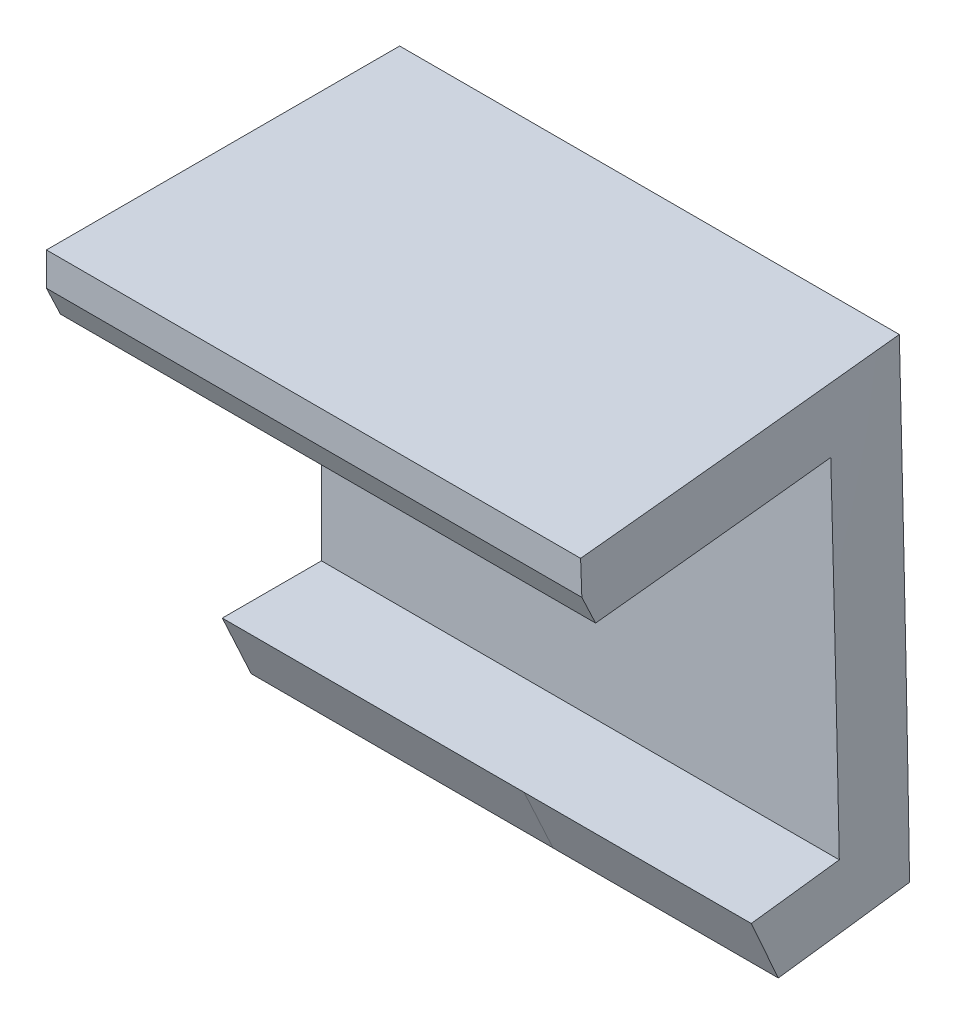
ISO-10303-21;
HEADER;
FILE_DESCRIPTION(('STEP AP214'),'2;1');
FILE_NAME('part.step','',(''),(''),'','','');
FILE_SCHEMA(('AUTOMOTIVE_DESIGN { 1 0 10303 214 1 1 1 1 }'));
ENDSEC;
DATA;
#1=APPLICATION_CONTEXT('core data for automotive mechanical design processes');
#2=APPLICATION_PROTOCOL_DEFINITION('international standard','automotive_design',2000,#1);
#3=PRODUCT_CONTEXT('',#1,'mechanical');
#4=PRODUCT('Part','Part','',(#3));
#5=PRODUCT_RELATED_PRODUCT_CATEGORY('part','',(#4));
#6=PRODUCT_DEFINITION_FORMATION('','',#4);
#7=PRODUCT_DEFINITION_CONTEXT('part definition',#1,'design');
#8=PRODUCT_DEFINITION('design','',#6,#7);
#9=PRODUCT_DEFINITION_SHAPE('','',#8);
#10=(LENGTH_UNIT() NAMED_UNIT(*) SI_UNIT(.MILLI.,.METRE.));
#11=(NAMED_UNIT(*) PLANE_ANGLE_UNIT() SI_UNIT($,.RADIAN.));
#12=(NAMED_UNIT(*) SI_UNIT($,.STERADIAN.) SOLID_ANGLE_UNIT());
#13=UNCERTAINTY_MEASURE_WITH_UNIT(LENGTH_MEASURE(1.E-05),#10,'distance_accuracy_value','');
#14=(GEOMETRIC_REPRESENTATION_CONTEXT(3) GLOBAL_UNCERTAINTY_ASSIGNED_CONTEXT((#13)) GLOBAL_UNIT_ASSIGNED_CONTEXT((#10,
#11,#12)) REPRESENTATION_CONTEXT('',''));
#15=CARTESIAN_POINT('',(0.,0.,0.));
#16=DIRECTION('',(0.,0.,1.));
#17=DIRECTION('',(1.,0.,0.));
#18=AXIS2_PLACEMENT_3D('',#15,#16,#17);
#19=CARTESIAN_POINT('',(138.441970265516,58.9864015562166,21.4522105914858));
#20=DIRECTION('',(-1.,0.,0.));
#21=DIRECTION('',(0.,0.,1.));
#22=AXIS2_PLACEMENT_3D('',#19,#20,#21);
#23=PLANE('',#22);
#24=CARTESIAN_POINT('',(138.441970265516,42.8621191093471,21.2239942519831));
#25=CARTESIAN_POINT('',(138.441970265516,42.7369326642426,21.1644427052116));
#26=CARTESIAN_POINT('',(138.441970265516,42.6116961267293,21.1048814049397));
#27=CARTESIAN_POINT('',(138.441970265516,42.4864015562166,21.0453157806406));
#28=(BOUNDED_CURVE() B_SPLINE_CURVE(3,(#24,#25,#26,#27),.UNSPECIFIED.,.F.,
.F.) B_SPLINE_CURVE_WITH_KNOTS((4,4),(-0.748256264685085,-0.701957454945299),
.UNSPECIFIED.) CURVE() GEOMETRIC_REPRESENTATION_ITEM() RATIONAL_B_SPLINE_CURVE((1.,1.,1.,1.)) REPRESENTATION_ITEM(''));
#29=CARTESIAN_POINT('',(138.441970265516,42.4864015562166,21.0453157806406));
#30=VERTEX_POINT('',#29);
#31=CARTESIAN_POINT('',(138.441970265516,42.8621191093471,21.2239942519831));
#32=VERTEX_POINT('',#31);
#33=EDGE_CURVE('E126',#30,#32,#28,.F.);
#34=ORIENTED_EDGE('',*,*,#33,.T.);
#35=DIRECTION('',(0.,-1.,0.));
#36=VECTOR('',#35,1.);
#37=CARTESIAN_POINT('',(138.441970265516,43.2864015562166,21.2239942519831));
#38=LINE('',#37,#36);
#39=CARTESIAN_POINT('',(138.441970265516,43.2864015562166,21.2239942519831));
#40=VERTEX_POINT('',#39);
#41=EDGE_CURVE('E47',#40,#32,#38,.T.);
#42=ORIENTED_EDGE('',*,*,#41,.F.);
#43=DIRECTION('',(0.,0.,1.));
#44=VECTOR('',#43,1.);
#45=CARTESIAN_POINT('',(138.441970265516,43.2864015562166,16.7084422828931));
#46=LINE('',#45,#44);
#47=CARTESIAN_POINT('',(138.441970265516,43.2864015562166,16.7084422828931));
#48=VERTEX_POINT('',#47);
#49=EDGE_CURVE('E142',#48,#40,#46,.T.);
#50=ORIENTED_EDGE('',*,*,#49,.F.);
#51=DIRECTION('',(0.,1.,0.));
#52=VECTOR('',#51,1.);
#53=CARTESIAN_POINT('',(138.441970265516,37.2864015562167,16.7084422828931));
#54=LINE('',#53,#52);
#55=CARTESIAN_POINT('',(138.441970265516,37.2864015562167,16.7084422828931));
#56=VERTEX_POINT('',#55);
#57=EDGE_CURVE('E147',#56,#48,#54,.T.);
#58=ORIENTED_EDGE('',*,*,#57,.F.);
#59=DIRECTION('',(0.,0.,-1.));
#60=VECTOR('',#59,1.);
#61=CARTESIAN_POINT('',(138.441970265516,37.2864015562166,21.2239942519831));
#62=LINE('',#61,#60);
#63=CARTESIAN_POINT('',(138.441970265516,37.2864015562166,18.6068869298385));
#64=VERTEX_POINT('',#63);
#65=EDGE_CURVE('E148',#64,#56,#62,.T.);
#66=ORIENTED_EDGE('',*,*,#65,.F.);
#67=CARTESIAN_POINT('',(138.441970265515,-89.9771736995002,295.611131350484));
#68=DIRECTION('',(-1.,0.,0.));
#69=DIRECTION('',(0.,-1.,0.));
#70=AXIS2_PLACEMENT_3D('',#67,#68,#69);
#71=CIRCLE('',#70,304.839907187232);
#72=CARTESIAN_POINT('',(138.441970265516,38.0864015562166,18.9758304457663));
#73=VERTEX_POINT('',#72);
#74=EDGE_CURVE('E428',#64,#73,#71,.F.);
#75=ORIENTED_EDGE('',*,*,#74,.T.);
#76=DIRECTION('',(0.,0.,1.));
#77=VECTOR('',#76,1.);
#78=CARTESIAN_POINT('',(138.441970265516,38.0864015562166,17.7084422828931));
#79=LINE('',#78,#77);
#80=CARTESIAN_POINT('',(138.441970265516,38.0864015562166,17.7084422828931));
#81=VERTEX_POINT('',#80);
#82=EDGE_CURVE('E145',#81,#73,#79,.T.);
#83=ORIENTED_EDGE('',*,*,#82,.F.);
#84=DIRECTION('',(0.,-1.,0.));
#85=VECTOR('',#84,1.);
#86=CARTESIAN_POINT('',(138.441970265516,42.4864015562166,17.7084422828931));
#87=LINE('',#86,#85);
#88=CARTESIAN_POINT('',(138.441970265516,42.4864015562166,17.7084422828931));
#89=VERTEX_POINT('',#88);
#90=EDGE_CURVE('E151',#89,#81,#87,.T.);
#91=ORIENTED_EDGE('',*,*,#90,.F.);
#92=DIRECTION('',(0.,0.,-1.));
#93=VECTOR('',#92,1.);
#94=CARTESIAN_POINT('',(138.441970265516,42.4864015562166,21.2239942519831));
#95=LINE('',#94,#93);
#96=EDGE_CURVE('E11',#30,#89,#95,.T.);
#97=ORIENTED_EDGE('',*,*,#96,.F.);
#98=EDGE_LOOP('',(#34,#42,#50,#58,#66,#75,#83,#91,#97));
#99=FACE_BOUND('',#98,.T.);
#100=ADVANCED_FACE('F38',(#99),#23,.T.);
#101=CARTESIAN_POINT('',(138.441970265516,42.4864015562166,19.4662182674381));
#102=DIRECTION('',(0.,-1.,0.));
#103=DIRECTION('',(-1.,0.,0.));
#104=AXIS2_PLACEMENT_3D('',#101,#102,#103);
#105=PLANE('',#104);
#106=DIRECTION('',(-1.,0.,0.));
#107=VECTOR('',#106,1.);
#108=CARTESIAN_POINT('',(146.228701255175,42.4864015562166,21.0453157806406));
#109=LINE('',#108,#107);
#110=CARTESIAN_POINT('',(145.283639860046,42.4864015562166,21.0453157806406));
#111=VERTEX_POINT('',#110);
#112=EDGE_CURVE('E133',#111,#30,#109,.T.);
#113=ORIENTED_EDGE('',*,*,#112,.T.);
#114=ORIENTED_EDGE('',*,*,#96,.T.);
#115=DIRECTION('',(1.,0.,0.));
#116=VECTOR('',#115,1.);
#117=CARTESIAN_POINT('',(138.441970265516,42.4864015562166,17.7084422828931));
#118=LINE('',#117,#116);
#119=CARTESIAN_POINT('',(144.953114036715,42.4864015562165,17.7084422828931));
#120=VERTEX_POINT('',#119);
#121=EDGE_CURVE('E42',#89,#120,#118,.T.);
#122=ORIENTED_EDGE('',*,*,#121,.T.);
#123=CARTESIAN_POINT('',(144.953114036715,42.4864015562165,17.7084422828931));
#124=CARTESIAN_POINT('',(144.981425489518,42.4864015562165,17.9864383334114));
#125=CARTESIAN_POINT('',(145.009513746378,42.4864015562166,18.2644569569387));
#126=CARTESIAN_POINT('',(145.065321171474,42.4864015562166,18.8205313966835));
#127=CARTESIAN_POINT('',(145.093040339535,42.4864015562166,19.0985872129187));
#128=CARTESIAN_POINT('',(145.148186835367,42.4864015562166,19.654727536487));
#129=CARTESIAN_POINT('',(145.175614163436,42.4864015562166,19.9328120437907));
#130=CARTESIAN_POINT('',(145.230011609723,42.4864015562166,20.4890262319451));
#131=CARTESIAN_POINT('',(145.25698172712,42.4864015562166,20.7671559128761));
#132=CARTESIAN_POINT('',(145.283640490335,42.4864015562166,21.0453157806406));
#133=B_SPLINE_CURVE_WITH_KNOTS('',3,(#123,#124,#125,#126,#127,#128,#129,#130,#131,#132),
.UNSPECIFIED.,.F.,.F.,(4,2,2,2,4),(0.,0.838301566937911,1.6766035333056,2.51490464550656,
3.35320726381075),.UNSPECIFIED.);
#134=EDGE_CURVE('E220',#120,#111,#133,.T.);
#135=ORIENTED_EDGE('',*,*,#134,.T.);
#136=EDGE_LOOP('',(#113,#114,#122,#135));
#137=FACE_BOUND('',#136,.T.);
#138=ADVANCED_FACE('F291',(#137),#105,.T.);
#139=CARTESIAN_POINT('',(138.441970265516,42.8864015562166,21.2239942519831));
#140=DIRECTION('',(0.,0.,1.));
#141=DIRECTION('',(0.,-1.,0.));
#142=AXIS2_PLACEMENT_3D('',#139,#140,#141);
#143=PLANE('',#142);
#144=ORIENTED_EDGE('',*,*,#41,.T.);
#145=DIRECTION('',(-1.,0.,0.));
#146=VECTOR('',#145,1.);
#147=CARTESIAN_POINT('',(146.228701255175,42.862119109347,21.2239942519831));
#148=LINE('',#147,#146);
#149=CARTESIAN_POINT('',(145.286768908345,42.862119109347,21.2239942519831));
#150=VERTEX_POINT('',#149);
#151=EDGE_CURVE('E123',#150,#32,#148,.T.);
#152=ORIENTED_EDGE('',*,*,#151,.F.);
#153=CARTESIAN_POINT('',(145.286768908345,42.862119109347,21.2239942519831));
#154=CARTESIAN_POINT('',(145.284122398998,42.93283352983,21.2239942519831));
#155=CARTESIAN_POINT('',(145.281466875231,43.0035476106439,21.2239942519831));
#156=CARTESIAN_POINT('',(145.276137798858,43.1449750929337,21.2239942519831));
#157=CARTESIAN_POINT('',(145.273464246252,43.2156884944096,21.2239942519831));
#158=CARTESIAN_POINT('',(145.270781679226,43.2864015562165,21.2239942519831));
#159=B_SPLINE_CURVE_WITH_KNOTS('',3,(#153,#154,#155,#156,#157,#158),.UNSPECIFIED.,.F.,.F.,(4,2,
4),(0.,0.212291773949166,0.424583547898327),.UNSPECIFIED.);
#160=CARTESIAN_POINT('',(145.270781679226,43.2864015562165,21.2239942519831));
#161=VERTEX_POINT('',#160);
#162=EDGE_CURVE('E211',#150,#161,#159,.T.);
#163=ORIENTED_EDGE('',*,*,#162,.T.);
#164=DIRECTION('',(1.,0.,0.));
#165=VECTOR('',#164,1.);
#166=CARTESIAN_POINT('',(138.441970265516,43.2864015562166,21.2239942519831));
#167=LINE('',#166,#165);
#168=EDGE_CURVE('E139',#40,#161,#167,.T.);
#169=ORIENTED_EDGE('',*,*,#168,.F.);
#170=EDGE_LOOP('',(#144,#152,#163,#169));
#171=FACE_BOUND('',#170,.T.);
#172=ADVANCED_FACE('F138',(#171),#143,.T.);
#173=CARTESIAN_POINT('',(138.441970265516,43.2864015562166,18.9662182674381));
#174=DIRECTION('',(0.,1.,0.));
#175=DIRECTION('',(1.,0.,0.));
#176=AXIS2_PLACEMENT_3D('',#173,#174,#175);
#177=PLANE('',#176);
#178=ORIENTED_EDGE('',*,*,#168,.T.);
#179=CARTESIAN_POINT('',(145.270781679226,43.2864015562165,21.2239942519832));
#180=CARTESIAN_POINT('',(145.253123138486,43.2864015562165,21.035778455035));
#181=CARTESIAN_POINT('',(145.235343250566,43.2864015562165,20.8475740947518));
#182=CARTESIAN_POINT('',(145.199582139298,43.2864015562165,20.4711845794441));
#183=CARTESIAN_POINT('',(145.181600916038,43.2864015562165,20.2829994244112));
#184=CARTESIAN_POINT('',(145.145478536035,43.2864015562165,19.9066450967054));
#185=CARTESIAN_POINT('',(145.127337379811,43.2864015562165,19.7184759239827));
#186=CARTESIAN_POINT('',(145.090948733074,43.2864015562166,19.3421478367115));
#187=CARTESIAN_POINT('',(145.072701242535,43.2864015562166,19.1539889221657));
#188=CARTESIAN_POINT('',(145.017759116928,43.2864015562166,18.589526198822));
#189=CARTESIAN_POINT('',(144.980865328875,43.2864015562166,18.2132416339496));
#190=CARTESIAN_POINT('',(144.906152113157,43.2864015562166,17.4607633402078));
#191=CARTESIAN_POINT('',(144.868332682487,43.2864015562165,17.0845696116373));
#192=CARTESIAN_POINT('',(144.829853263433,43.2864015562166,16.7084422828931));
#193=B_SPLINE_CURVE_WITH_KNOTS('',3,(#179,#180,#181,#182,#183,#184,#185,#186,#187,#188,#189,
#190,#191,#192),.UNSPECIFIED.,.F.,.F.,(4,2,2,2,2,2,4),(0.,0.567126937655628,1.13425362553777,
1.7013784721359,2.26850346325662,3.4027691883038,4.53703859634097),.UNSPECIFIED.);
#194=CARTESIAN_POINT('',(144.829853263433,43.2864015562166,16.7084422828931));
#195=VERTEX_POINT('',#194);
#196=EDGE_CURVE('E268',#161,#195,#193,.T.);
#197=ORIENTED_EDGE('',*,*,#196,.T.);
#198=DIRECTION('',(1.,0.,0.));
#199=VECTOR('',#198,1.);
#200=CARTESIAN_POINT('',(138.441970265516,43.2864015562166,16.7084422828931));
#201=LINE('',#200,#199);
#202=EDGE_CURVE('E155',#48,#195,#201,.T.);
#203=ORIENTED_EDGE('',*,*,#202,.F.);
#204=ORIENTED_EDGE('',*,*,#49,.T.);
#205=EDGE_LOOP('',(#178,#197,#203,#204));
#206=FACE_BOUND('',#205,.T.);
#207=ADVANCED_FACE('F40',(#206),#177,.T.);
#208=CARTESIAN_POINT('',(138.441970265516,40.2864015562166,16.7084422828931));
#209=DIRECTION('',(0.,0.,-1.));
#210=DIRECTION('',(0.,-1.,0.));
#211=AXIS2_PLACEMENT_3D('',#208,#209,#210);
#212=PLANE('',#211);
#213=ORIENTED_EDGE('',*,*,#202,.T.);
#214=CARTESIAN_POINT('',(144.829853263433,43.2864015562166,16.7084422828931));
#215=CARTESIAN_POINT('',(144.838246232589,42.9530925434356,16.7084422828931));
#216=CARTESIAN_POINT('',(144.846580383757,42.6197819501718,16.7084422828931));
#217=CARTESIAN_POINT('',(144.862999469421,41.9531558893104,16.7084422828931));
#218=CARTESIAN_POINT('',(144.87108440485,41.6198404217356,16.7084422828931));
#219=CARTESIAN_POINT('',(144.886873520473,40.9532013607333,16.7084422828931));
#220=CARTESIAN_POINT('',(144.894577701758,40.6198777673319,16.7084422828931));
#221=CARTESIAN_POINT('',(144.909485937683,39.9532188628369,16.7084422828931));
#222=CARTESIAN_POINT('',(144.91668999159,39.6198835517268,16.7084422828931));
#223=CARTESIAN_POINT('',(144.930478703947,38.9531995371911,16.7084422828931));
#224=CARTESIAN_POINT('',(144.93706336153,38.6198508337474,16.7084422828931));
#225=CARTESIAN_POINT('',(144.949487754285,37.9531377299988,16.7084422828931));
#226=CARTESIAN_POINT('',(144.955327485298,37.6197733296168,16.7084422828931));
#227=CARTESIAN_POINT('',(144.960731957429,37.2864015562165,16.7084422828931));
#228=B_SPLINE_CURVE_WITH_KNOTS('',3,(#214,#215,#216,#217,#218,#219,#220,#221,#222,#223,#224,
#225,#226,#227),.UNSPECIFIED.,.F.,.F.,(4,2,2,2,2,2,4),(0.,1.00024415123927,2.00048456110018,
3.00072210435743,4.00096111296956,5.0012015221897,6.00144751578877),.UNSPECIFIED.);
#229=CARTESIAN_POINT('',(144.960731957429,37.2864015562166,16.7084422828931));
#230=VERTEX_POINT('',#229);
#231=EDGE_CURVE('E262',#195,#230,#228,.T.);
#232=ORIENTED_EDGE('',*,*,#231,.T.);
#233=DIRECTION('',(1.,0.,0.));
#234=VECTOR('',#233,1.);
#235=CARTESIAN_POINT('',(138.441970265516,37.2864015562167,16.7084422828931));
#236=LINE('',#235,#234);
#237=EDGE_CURVE('E85',#56,#230,#236,.T.);
#238=ORIENTED_EDGE('',*,*,#237,.F.);
#239=ORIENTED_EDGE('',*,*,#57,.T.);
#240=EDGE_LOOP('',(#213,#232,#238,#239));
#241=FACE_BOUND('',#240,.T.);
#242=ADVANCED_FACE('F313',(#241),#212,.T.);
#243=CARTESIAN_POINT('',(138.441970265516,37.2864015562166,18.9662182674381));
#244=DIRECTION('',(0.,-1.,0.));
#245=DIRECTION('',(-1.,0.,0.));
#246=AXIS2_PLACEMENT_3D('',#243,#244,#245);
#247=PLANE('',#246);
#248=DIRECTION('',(1.,0.,0.));
#249=VECTOR('',#248,1.);
#250=CARTESIAN_POINT('',(138.440970265516,37.2864015562166,18.6068869298385));
#251=LINE('',#250,#249);
#252=CARTESIAN_POINT('',(142.301123440301,37.2864015562166,18.6068869298385));
#253=VERTEX_POINT('',#252);
#254=EDGE_CURVE('E55',#64,#253,#251,.T.);
#255=ORIENTED_EDGE('',*,*,#254,.F.);
#256=ORIENTED_EDGE('',*,*,#65,.T.);
#257=ORIENTED_EDGE('',*,*,#237,.T.);
#258=CARTESIAN_POINT('',(144.960731957429,37.2864015562166,16.7084422828931));
#259=CARTESIAN_POINT('',(144.979544855276,37.2864015562166,16.8665918107964));
#260=CARTESIAN_POINT('',(144.998251554025,37.2864015562166,17.0247539942806));
#261=CARTESIAN_POINT('',(145.035437426485,37.2864015562166,17.341104725738));
#262=CARTESIAN_POINT('',(145.053916600729,37.2864015562165,17.4992932736485));
#263=CARTESIAN_POINT('',(145.090632387156,37.2864015562165,17.8156985414489));
#264=CARTESIAN_POINT('',(145.108868999321,37.2864015562165,17.9739152613408));
#265=CARTESIAN_POINT('',(145.145084990407,37.2864015562165,18.2903785112778));
#266=CARTESIAN_POINT('',(145.163064368723,37.2864015562165,18.4486250413919));
#267=CARTESIAN_POINT('',(145.180907752322,37.2864015562165,18.6068869298385));
#268=B_SPLINE_CURVE_WITH_KNOTS('',3,(#258,#259,#260,#261,#262,#263,#264,#265,#266,#267),
.UNSPECIFIED.,.F.,.F.,(4,2,2,2,4),(0.,0.477793659850592,0.955586197649547,1.4333787698146,
1.9111724640312),.UNSPECIFIED.);
#269=CARTESIAN_POINT('',(145.180907142459,37.2864015562165,18.6068869298385));
#270=VERTEX_POINT('',#269);
#271=EDGE_CURVE('E134',#230,#270,#268,.T.);
#272=ORIENTED_EDGE('',*,*,#271,.T.);
#273=DIRECTION('',(-1.,0.,0.));
#274=VECTOR('',#273,1.);
#275=CARTESIAN_POINT('',(146.228701255175,37.2864015562165,18.6068869298385));
#276=LINE('',#275,#274);
#277=EDGE_CURVE('E169',#270,#253,#276,.T.);
#278=ORIENTED_EDGE('',*,*,#277,.T.);
#279=EDGE_LOOP('',(#255,#256,#257,#272,#278));
#280=FACE_BOUND('',#279,.T.);
#281=ADVANCED_FACE('F310',(#280),#247,.T.);
#282=CARTESIAN_POINT('',(138.441970265516,38.0864015562166,19.4662182674381));
#283=DIRECTION('',(0.,1.,0.));
#284=DIRECTION('',(1.,0.,0.));
#285=AXIS2_PLACEMENT_3D('',#282,#283,#284);
#286=PLANE('',#285);
#287=DIRECTION('',(1.,0.,0.));
#288=VECTOR('',#287,1.);
#289=CARTESIAN_POINT('',(138.440970265516,38.0864015562166,18.9758304457663));
#290=LINE('',#289,#288);
#291=CARTESIAN_POINT('',(142.301123440301,38.0864015562166,18.9758304457663));
#292=VERTEX_POINT('',#291);
#293=EDGE_CURVE('E302',#73,#292,#290,.T.);
#294=ORIENTED_EDGE('',*,*,#293,.T.);
#295=DIRECTION('',(-1.,0.,0.));
#296=VECTOR('',#295,1.);
#297=CARTESIAN_POINT('',(146.228701255175,38.0864015562166,18.9758304457663));
#298=LINE('',#297,#296);
#299=CARTESIAN_POINT('',(145.204524800934,38.0864015562166,18.9758304457663));
#300=VERTEX_POINT('',#299);
#301=EDGE_CURVE('E173',#300,#292,#298,.T.);
#302=ORIENTED_EDGE('',*,*,#301,.F.);
#303=CARTESIAN_POINT('',(145.204525709516,38.0864015562166,18.9758304457663));
#304=CARTESIAN_POINT('',(145.181253755187,38.0864015562166,18.764552523953));
#305=CARTESIAN_POINT('',(145.157774194478,38.0864015562166,18.5532978828069));
#306=CARTESIAN_POINT('',(145.110399860298,38.0864015562165,18.1308351618493));
#307=CARTESIAN_POINT('',(145.086505086828,38.0864015562165,17.9196270820378));
#308=CARTESIAN_POINT('',(145.062402706977,38.0864015562164,17.7084422828936));
#309=B_SPLINE_CURVE_WITH_KNOTS('',3,(#303,#304,#305,#306,#307,#308),.UNSPECIFIED.,.F.,.F.,(4,2,
4),(0.,0.637666306614755,1.2753326132295),.UNSPECIFIED.);
#310=CARTESIAN_POINT('',(145.062402706977,38.0864015562166,17.7084422828931));
#311=VERTEX_POINT('',#310);
#312=EDGE_CURVE('E226',#300,#311,#309,.T.);
#313=ORIENTED_EDGE('',*,*,#312,.T.);
#314=DIRECTION('',(1.,0.,0.));
#315=VECTOR('',#314,1.);
#316=CARTESIAN_POINT('',(138.441970265516,38.0864015562166,17.7084422828931));
#317=LINE('',#316,#315);
#318=EDGE_CURVE('E149',#81,#311,#317,.T.);
#319=ORIENTED_EDGE('',*,*,#318,.F.);
#320=ORIENTED_EDGE('',*,*,#82,.T.);
#321=EDGE_LOOP('',(#294,#302,#313,#319,#320));
#322=FACE_BOUND('',#321,.T.);
#323=ADVANCED_FACE('F300',(#322),#286,.T.);
#324=CARTESIAN_POINT('',(138.441970265516,40.2864015562166,17.7084422828931));
#325=DIRECTION('',(0.,0.,1.));
#326=DIRECTION('',(1.,0.,0.));
#327=AXIS2_PLACEMENT_3D('',#324,#325,#326);
#328=PLANE('',#327);
#329=ORIENTED_EDGE('',*,*,#318,.T.);
#330=CARTESIAN_POINT('',(145.062402706977,38.0864015562166,17.7084422828931));
#331=CARTESIAN_POINT('',(145.054778074579,38.4531036544115,17.7084422828931));
#332=CARTESIAN_POINT('',(145.046671842499,38.8197953334699,17.7084422828931));
#333=CARTESIAN_POINT('',(145.02966448807,39.5531592290661,17.7084422828931));
#334=CARTESIAN_POINT('',(145.020763368082,39.9198314456583,17.7084422828931));
#335=CARTESIAN_POINT('',(145.002334503159,40.6531598303879,17.7084422828931));
#336=CARTESIAN_POINT('',(144.992806758461,41.0198159985313,17.7084422828931));
#337=CARTESIAN_POINT('',(144.973277498469,41.7531168395399,17.7084422828931));
#338=CARTESIAN_POINT('',(144.963275981769,42.1197615123678,17.7084422828931));
#339=CARTESIAN_POINT('',(144.953114036715,42.4864015562165,17.7084422828931));
#340=B_SPLINE_CURVE_WITH_KNOTS('',3,(#330,#331,#332,#333,#334,#335,#336,#337,#338,#339),
.UNSPECIFIED.,.F.,.F.,(4,2,2,2,4),(0.,1.10034317917701,2.20068309181714,3.30102258768743,
4.40136535009585),.UNSPECIFIED.);
#341=EDGE_CURVE('E230',#311,#120,#340,.T.);
#342=ORIENTED_EDGE('',*,*,#341,.T.);
#343=ORIENTED_EDGE('',*,*,#121,.F.);
#344=ORIENTED_EDGE('',*,*,#90,.T.);
#345=EDGE_LOOP('',(#329,#342,#343,#344));
#346=FACE_BOUND('',#345,.T.);
#347=ADVANCED_FACE('F294',(#346),#328,.T.);
#348=CARTESIAN_POINT('',(145.292643366567,46.2352111335059,22.8249641058051));
#349=CARTESIAN_POINT('',(145.292715670716,46.2161716820332,22.8159848987683));
#350=CARTESIAN_POINT('',(145.294354665075,45.7742523069027,22.6075320882647));
#351=CARTESIAN_POINT('',(145.295789350292,44.9096792492725,22.1981147436125));
#352=CARTESIAN_POINT('',(145.29256128028,43.6409800443879,21.5947369973265));
#353=CARTESIAN_POINT('',(145.283595206326,42.3701437639069,20.9898036421991));
#354=CARTESIAN_POINT('',(145.268439343964,41.0948267012698,20.3845890044108));
#355=CARTESIAN_POINT('',(145.246585031453,39.8133930144486,19.7802964503774));
#356=CARTESIAN_POINT('',(145.21746823689,38.5247607600021,19.1780783715676));
#357=CARTESIAN_POINT('',(145.180467920989,37.2284787042143,18.5790531005983));
#358=CARTESIAN_POINT('',(145.134916326958,35.924556828039,17.9842103770565));
#359=CARTESIAN_POINT('',(145.080104694923,34.6137204159724,17.3937760116011));
#360=CARTESIAN_POINT('',(145.015166200294,33.2968274722133,16.8089089777821));
#361=CARTESIAN_POINT('',(144.939215051884,31.9752710103335,16.2305547959101));
#362=CARTESIAN_POINT('',(144.871430507781,30.9537505085406,15.7902512437439));
#363=CARTESIAN_POINT('',(144.82923399511,30.3734283781046,15.542636394938));
#364=CARTESIAN_POINT('',(144.818942295739,30.2348587544011,15.4836538067465));
#365=CARTESIAN_POINT('',(145.23118208207,46.1945141052125,22.0726826087883));
#366=CARTESIAN_POINT('',(145.23123945345,46.1754469086034,22.0640570758335));
#367=CARTESIAN_POINT('',(145.232533120329,45.7328768845372,21.863813072157));
#368=CARTESIAN_POINT('',(145.233348807338,44.866818183206,21.4704385861034));
#369=CARTESIAN_POINT('',(145.229360595116,43.5956416580975,20.8904773726773));
#370=CARTESIAN_POINT('',(145.219754274966,42.3223997351965,20.3087984010157));
#371=CARTESIAN_POINT('',(145.204050347856,41.0450159026494,19.7266292055811));
#372=CARTESIAN_POINT('',(145.181719602998,39.7620403041004,19.145128056017));
#373=CARTESIAN_POINT('',(145.152182056274,38.4726894922078,18.5654048250947));
#374=CARTESIAN_POINT('',(145.114799252497,37.1766419447374,17.9885365825417));
#375=CARTESIAN_POINT('',(145.068889265523,35.874001851605,17.4154802457113));
#376=CARTESIAN_POINT('',(145.013733454357,34.5656078632023,16.84645633009));
#377=CARTESIAN_POINT('',(144.948466486685,33.2523115755084,16.2825840051212));
#378=CARTESIAN_POINT('',(144.872166840972,31.935512013565,15.724784420237));
#379=CARTESIAN_POINT('',(144.804186376479,30.9185575530304,15.2998528210823));
#380=CARTESIAN_POINT('',(144.761767209635,30.3410690237516,15.0608081724359));
#381=CARTESIAN_POINT('',(144.751414342138,30.2031894948503,15.0038635464812));
#382=CARTESIAN_POINT('',(145.10808702886,46.0797064612533,20.5957090065986));
#383=CARTESIAN_POINT('',(145.108112907336,46.0605981039427,20.5877673423778));
#384=CARTESIAN_POINT('',(145.108677782088,45.617064544668,20.4033963227921));
#385=CARTESIAN_POINT('',(145.108164276966,44.7488997455524,20.0410573484355));
#386=CARTESIAN_POINT('',(145.102481066339,43.4745298099494,19.506432084151));
#387=CARTESIAN_POINT('',(145.091383585614,42.1985381582999,18.9698056286328));
#388=CARTESIAN_POINT('',(145.074340921474,40.919352991033,18.432313795848));
#389=CARTESIAN_POINT('',(145.050787858805,39.6357971720958,17.895031497442));
#390=CARTESIAN_POINT('',(145.02011771928,38.3476058635824,17.3589891989597));
#391=CARTESIAN_POINT('',(144.981662313651,37.0546405512182,16.825190387585));
#392=CARTESIAN_POINT('',(144.934716420947,35.7571271997388,16.2945085732848));
#393=CARTESIAN_POINT('',(144.878546788619,34.4560777056042,15.7671349277429));
#394=CARTESIAN_POINT('',(144.812296499439,33.1522797743469,15.2440749457713));
#395=CARTESIAN_POINT('',(144.734975853584,31.8471118875531,14.7262511433062));
#396=CARTESIAN_POINT('',(144.666363735124,30.840740006255,14.3313459279441));
#397=CARTESIAN_POINT('',(144.623360712846,30.2696869190903,14.1090680127522));
#398=CARTESIAN_POINT('',(144.612852253998,30.1333684734716,14.0561097289791));
#399=CARTESIAN_POINT('',(144.928748528409,45.8313056352206,18.4648897324114));
#400=CARTESIAN_POINT('',(144.928710770657,45.8121883906115,18.4579040614451));
#401=CARTESIAN_POINT('',(144.927801168407,45.3684480154743,18.2957230038003));
#402=CARTESIAN_POINT('',(144.92451689411,44.4999353071051,17.9768086087873));
#403=CARTESIAN_POINT('',(144.915080099105,43.2258754388495,17.5057237841142));
#404=CARTESIAN_POINT('',(144.900477388665,41.9513989381843,17.0323519855983));
#405=CARTESIAN_POINT('',(144.880112035707,40.6755612894933,16.5576915788912));
#406=CARTESIAN_POINT('',(144.853378163767,39.3974067156949,16.082676245688));
#407=CARTESIAN_POINT('',(144.819644070439,38.117277789963,15.6082040453565));
#408=CARTESIAN_POINT('',(144.778210606955,36.8351464588567,15.1351452063737));
#409=CARTESIAN_POINT('',(144.728350957703,35.5512776461586,14.6643219957981));
#410=CARTESIAN_POINT('',(144.669323994036,34.2668265690774,14.1959572981869));
#411=CARTESIAN_POINT('',(144.600299469929,32.9823814978558,13.7310051504255));
#412=CARTESIAN_POINT('',(144.520194434324,31.6992033257195,13.2703412055572));
#413=CARTESIAN_POINT('',(144.449724864174,30.7117721013247,12.9184192247878));
#414=CARTESIAN_POINT('',(144.405333389695,30.1519455938186,12.7201558785653));
#415=CARTESIAN_POINT('',(144.394469321032,30.0183323434163,12.6729091733836));
#416=CARTESIAN_POINT('',(144.76553257299,45.6205885798533,16.635240265859));
#417=CARTESIAN_POINT('',(144.765422848451,45.6015065429212,16.6290486957268));
#418=CARTESIAN_POINT('',(144.762844897244,45.158588282828,16.4853006496275));
#419=CARTESIAN_POINT('',(144.75638806547,44.2919350494524,16.2024912489533));
#420=CARTESIAN_POINT('',(144.742559943089,43.0217875884795,15.7843120399274));
#421=CARTESIAN_POINT('',(144.723783010297,41.7525450138091,15.3636563017284));
#422=CARTESIAN_POINT('',(144.69941119957,40.4836662864898,14.9414173936158));
#423=CARTESIAN_POINT('',(144.668812104985,39.2142843835586,14.5184681087953));
#424=CARTESIAN_POINT('',(144.631343799403,37.9451575041878,14.0956448222313));
#425=CARTESIAN_POINT('',(144.586289306052,36.6762452177086,13.6737716674703));
#426=CARTESIAN_POINT('',(144.53291184681,35.4077488701638,13.2535736117798));
#427=CARTESIAN_POINT('',(144.47047320736,34.1408780000678,12.8352364115921));
#428=CARTESIAN_POINT('',(144.398176361602,32.8759679205389,12.4195901046612));
#429=CARTESIAN_POINT('',(144.314859770648,31.6141711313616,12.0074619775629));
#430=CARTESIAN_POINT('',(144.242242810935,30.6444677768266,11.6921107727753));
#431=CARTESIAN_POINT('',(144.196343954819,30.0950280829995,11.5143015303848));
#432=CARTESIAN_POINT('',(144.185098843115,29.9639181201688,11.4719204857897));
#433=CARTESIAN_POINT('',(144.659897472599,45.504009755708,15.5246715516654));
#434=CARTESIAN_POINT('',(144.659732627451,45.4849757114184,15.518948257945));
#435=CARTESIAN_POINT('',(144.655876603208,45.0431755606124,15.3860701895485));
#436=CARTESIAN_POINT('',(144.646978269813,44.1789047848528,15.1245630362295));
#437=CARTESIAN_POINT('',(144.629744964028,42.9130553041268,14.7376657341041));
#438=CARTESIAN_POINT('',(144.607715259332,41.6489349652757,14.3482977451026));
#439=CARTESIAN_POINT('',(144.580216723232,40.3861694305593,13.9572979489605));
#440=CARTESIAN_POINT('',(144.546604412772,39.1239159372636,13.5654578236365));
#441=CARTESIAN_POINT('',(144.506235783451,37.8631467604873,13.1735416093475));
#442=CARTESIAN_POINT('',(144.458386741757,36.6037771885358,12.7823011465458));
#443=CARTESIAN_POINT('',(144.40231796874,35.3459409489574,12.3924134775978));
#444=CARTESIAN_POINT('',(144.337297416391,34.0908545142517,12.0040573358163));
#445=CARTESIAN_POINT('',(144.262552093805,32.8387031482141,11.6180060556055));
#446=CARTESIAN_POINT('',(144.176874152807,31.5904808543976,11.235058778028));
#447=CARTESIAN_POINT('',(144.102682464091,30.6320714043171,10.9417258799335));
#448=CARTESIAN_POINT('',(144.055718081013,30.0890929413671,10.7762408926528));
#449=CARTESIAN_POINT('',(144.044206042952,29.9595150942453,10.7367921796526));
#450=CARTESIAN_POINT('',(144.616816049129,45.4607071532377,15.0832818535546));
#451=CARTESIAN_POINT('',(144.616627175636,45.4416965213258,15.077742883959));
#452=CARTESIAN_POINT('',(144.612213984671,45.0004414914687,14.949143798716));
#453=CARTESIAN_POINT('',(144.602250217663,44.1373165431757,14.6960352141334));
#454=CARTESIAN_POINT('',(144.583528646799,42.8734667490523,14.3214904771213));
#455=CARTESIAN_POINT('',(144.560076364698,41.6116672955812,13.944474779242));
#456=CARTESIAN_POINT('',(144.531211027527,40.3515974917102,13.5657973398251));
#457=CARTESIAN_POINT('',(144.496283219318,39.0924209537377,13.186226574856));
#458=CARTESIAN_POINT('',(144.454651047981,37.835190325863,12.8065038805718));
#459=CARTESIAN_POINT('',(144.405588098293,36.5797998073532,12.4273601141755));
#460=CARTESIAN_POINT('',(144.348354555007,35.3263506028498,12.0494518260418));
#461=CARTESIAN_POINT('',(144.282221333037,34.0760687216077,11.6729526305021));
#462=CARTESIAN_POINT('',(144.206426018745,32.8290459888456,11.2986106779795));
#463=CARTESIAN_POINT('',(144.119740598193,31.5863336497096,10.9272133069574));
#464=CARTESIAN_POINT('',(144.044884138998,30.6320973212678,10.6426014412725));
#465=CARTESIAN_POINT('',(143.997477151945,30.0913528219056,10.4819997753807));
#466=CARTESIAN_POINT('',(143.985854428561,29.9623077533315,10.4437130341721));
#467=(BOUNDED_SURFACE() B_SPLINE_SURFACE(3,3,((#348,#349,#350,#351,#352,#353,#354,#355,#356,
#357,#358,#359,#360,#361,#362,#363,#364),(#365,#366,#367,#368,#369,#370,#371,#372,#373,#374,
#375,#376,#377,#378,#379,#380,#381),(#382,#383,#384,#385,#386,#387,#388,#389,#390,#391,#392,
#393,#394,#395,#396,#397,#398),(#399,#400,#401,#402,#403,#404,#405,#406,#407,#408,#409,#410,
#411,#412,#413,#414,#415),(#416,#417,#418,#419,#420,#421,#422,#423,#424,#425,#426,#427,#428,
#429,#430,#431,#432),(#433,#434,#435,#436,#437,#438,#439,#440,#441,#442,#443,#444,#445,#446,
#447,#448,#449),(#450,#451,#452,#453,#454,#455,#456,#457,#458,#459,#460,#461,#462,#463,#464,
#465,#466)),.UNSPECIFIED.,.F.,.F.,.F.) B_SPLINE_SURFACE_WITH_KNOTS((4,1,1,1,4),(4,1,1,1,1,1,1,1,
1,1,1,1,1,1,4),(-4.88078101475172E-05,1.60217650997796,3.20435301995593,4.80652952993389,
5.88515899732004),(29.8739714353347,29.9413726722074,31.4384413058178,32.9355099394282,
34.4325785730385,35.9296472066489,37.4267158402593,38.9237844738696,40.42085310748,
41.9179217410904,43.4149903747008,44.9120590083111,46.4091276419215,47.9061962755319,
48.3757656673937),.UNSPECIFIED.) GEOMETRIC_REPRESENTATION_ITEM() RATIONAL_B_SPLINE_SURFACE(((1.,
1.,1.,1.,1.,1.,1.,1.,1.,1.,1.,1.,1.,1.,1.,1.,1.),(1.,1.,1.,1.,1.,1.,1.,1.,1.,1.,1.,1.,1.,1.,1.,
1.,1.),(1.,1.,1.,1.,1.,1.,1.,1.,1.,1.,1.,1.,1.,1.,1.,1.,1.),(1.,1.,1.,1.,1.,1.,1.,1.,1.,1.,1.,
1.,1.,1.,1.,1.,1.),(1.,1.,1.,1.,1.,1.,1.,1.,1.,1.,1.,1.,1.,1.,1.,1.,1.),(1.,1.,1.,1.,1.,1.,1.,
1.,1.,1.,1.,1.,1.,1.,1.,1.,1.),(1.,1.,1.,1.,1.,1.,1.,1.,1.,1.,1.,1.,1.,1.,1.,1.,1.))) REPRESENTATION_ITEM('') SURFACE());
#468=CARTESIAN_POINT('',(145.204526410438,38.0863988319485,18.9758362349127));
#469=CARTESIAN_POINT('',(145.203607509704,38.0531209789812,18.960431683617));
#470=CARTESIAN_POINT('',(145.202680717626,38.0198406371483,18.9450329794341));
#471=CARTESIAN_POINT('',(145.200810977857,37.9532648144174,18.914242703192));
#472=CARTESIAN_POINT('',(145.199868025339,37.9199693319933,18.8988511347257));
#473=CARTESIAN_POINT('',(145.197965862753,37.8533632295479,18.8680752809754));
#474=CARTESIAN_POINT('',(145.197006647852,37.8200526079949,18.8526909993051));
#475=CARTESIAN_POINT('',(145.195071858586,37.753416228837,18.8219298701942));
#476=CARTESIAN_POINT('',(145.194096279382,37.720090469695,18.8065530263878));
#477=CARTESIAN_POINT('',(145.192128659591,37.6534238168824,18.7758069240555));
#478=CARTESIAN_POINT('',(145.191136614159,37.6200829216693,18.7604376691842));
#479=CARTESIAN_POINT('',(145.189135959994,37.5533859982484,18.7297068957717));
#480=CARTESIAN_POINT('',(145.18812734641,37.5200299684932,18.7143453809052));
#481=CARTESIAN_POINT('',(145.186093454019,37.4533027774993,18.6836302385545));
#482=CARTESIAN_POINT('',(145.185068170354,37.4199316147081,18.6682766147649));
#483=CARTESIAN_POINT('',(145.183000835901,37.3531741592332,18.6375774056124));
#484=CARTESIAN_POINT('',(145.181958780249,37.319787864992,18.6222318239637));
#485=CARTESIAN_POINT('',(145.180908444427,37.2863989141422,18.60689259171));
#486=B_SPLINE_CURVE_WITH_KNOTS('',3,(#468,#469,#470,#471,#472,#473,#474,#475,#476,#477,#478,
#479,#480,#481,#482,#483,#484,#485),.UNSPECIFIED.,.F.,.F.,(4,2,2,2,2,2,2,2,4),(0.,
0.110045628795557,0.220124722849294,0.330237130116061,0.440382699359208,0.550561280157104,
0.660772722909634,0.771016878844823,0.881293600025344),.UNSPECIFIED.);
#487=EDGE_CURVE('E136',#300,#270,#486,.T.);
#488=CARTESIAN_POINT('',(145.283640490335,42.4864015562166,21.0453157806406));
#489=CARTESIAN_POINT('',(145.283770834736,42.5020626146197,21.0527611209823));
#490=CARTESIAN_POINT('',(145.283901185509,42.5177235320292,21.0602067577856));
#491=CARTESIAN_POINT('',(145.284161887057,42.5490435843096,21.0750978751106));
#492=CARTESIAN_POINT('',(145.284292237831,42.5647027192064,21.0825433555778));
#493=CARTESIAN_POINT('',(145.284552939379,42.5960192374785,21.0974341390219));
#494=CARTESIAN_POINT('',(145.284683290153,42.6116766208781,21.1048794419479));
#495=CARTESIAN_POINT('',(145.284943991701,42.6429896671759,21.1197698490962));
#496=CARTESIAN_POINT('',(145.285074342474,42.6586453300969,21.127214953271));
#497=CARTESIAN_POINT('',(145.285335044023,42.6899549664569,21.1421049417051));
#498=CARTESIAN_POINT('',(145.285465394796,42.7056089399171,21.1495498259201));
#499=CARTESIAN_POINT('',(145.285726096344,42.7369152283751,21.1644393532223));
#500=CARTESIAN_POINT('',(145.285856447118,42.7525675433926,21.1718839962683));
#501=CARTESIAN_POINT('',(145.286117148666,42.7838705459842,21.1867730200214));
#502=CARTESIAN_POINT('',(145.28624749944,42.7995212335765,21.1942174006904));
#503=CARTESIAN_POINT('',(145.286508200988,42.8308210123392,21.2091058784742));
#504=CARTESIAN_POINT('',(145.286638551762,42.8464701035263,21.2165499755539));
#505=CARTESIAN_POINT('',(145.286768908345,42.862119109347,21.2239942519831));
#506=B_SPLINE_CURVE_WITH_KNOTS('',3,(#488,#489,#490,#491,#492,#493,#494,#495,#496,#497,#498,
#499,#500,#501,#502,#503,#504,#505),.UNSPECIFIED.,.F.,.F.,(4,2,2,2,2,2,2,2,4),(0.,
0.0520237397199311,0.104042448726506,0.156056183798623,0.208065001705226,0.260068959205859,
0.31206811305118,0.364062519983491,0.416052236737372),.UNSPECIFIED.);
#507=EDGE_CURVE('E128',#111,#150,#506,.T.);
#508=ORIENTED_EDGE('',*,*,#341,.F.);
#509=ORIENTED_EDGE('',*,*,#312,.F.);
#510=ORIENTED_EDGE('',*,*,#487,.T.);
#511=ORIENTED_EDGE('',*,*,#271,.F.);
#512=ORIENTED_EDGE('',*,*,#231,.F.);
#513=ORIENTED_EDGE('',*,*,#196,.F.);
#514=ORIENTED_EDGE('',*,*,#162,.F.);
#515=ORIENTED_EDGE('',*,*,#507,.F.);
#516=ORIENTED_EDGE('',*,*,#134,.F.);
#517=EDGE_LOOP('',(#508,#509,#510,#511,#512,#513,#514,#515,#516));
#518=FACE_BOUND('',#517,.T.);
#519=ADVANCED_FACE('F199',(#518),#467,.F.);
#520=CARTESIAN_POINT('',(146.228701255175,42.862119109347,21.2239942519831));
#521=CARTESIAN_POINT('',(146.228701255175,42.7369326642425,21.1644427052116));
#522=CARTESIAN_POINT('',(146.228701255175,42.6116961267292,21.1048814049397));
#523=CARTESIAN_POINT('',(146.228701255175,42.4864015562166,21.0453157806406));
#524=(BOUNDED_CURVE() B_SPLINE_CURVE(3,(#520,#521,#522,#523),.UNSPECIFIED.,.F.,
.F.) B_SPLINE_CURVE_WITH_KNOTS((4,4),(-0.748256264685085,-0.701957454945299),
.UNSPECIFIED.) CURVE() GEOMETRIC_REPRESENTATION_ITEM() RATIONAL_B_SPLINE_CURVE((1.,1.,1.,1.)) REPRESENTATION_ITEM(''));
#525=DIRECTION('',(-1.,0.,0.));
#526=VECTOR('',#525,1.);
#527=SURFACE_OF_LINEAR_EXTRUSION('',#524,#526);
#528=ORIENTED_EDGE('',*,*,#112,.F.);
#529=ORIENTED_EDGE('',*,*,#507,.T.);
#530=ORIENTED_EDGE('',*,*,#151,.T.);
#531=ORIENTED_EDGE('',*,*,#33,.F.);
#532=EDGE_LOOP('',(#528,#529,#530,#531));
#533=FACE_BOUND('',#532,.T.);
#534=ADVANCED_FACE('F125',(#533),#527,.F.);
#535=CARTESIAN_POINT('',(146.228701255175,38.0864015562166,18.9758304457663));
#536=CARTESIAN_POINT('',(146.228701255175,38.0450897538148,18.9567067522076));
#537=CARTESIAN_POINT('',(146.228701255175,37.7779613273325,18.8331198435529));
#538=CARTESIAN_POINT('',(146.228701255175,37.5114364173692,18.7102696998921));
#539=CARTESIAN_POINT('',(146.228701255175,37.2864015562165,18.6068869298385));
#540=(BOUNDED_CURVE() B_SPLINE_CURVE(3,(#535,#536,#537,#538,#539),.UNSPECIFIED.,.F.,
.F.) B_SPLINE_CURVE_WITH_KNOTS((4,1,4),(-0.164039551102507,-0.14899358367294,
-0.066728455984581),
.UNSPECIFIED.) CURVE() GEOMETRIC_REPRESENTATION_ITEM() RATIONAL_B_SPLINE_CURVE((1.,1.,1.,1.,1.)) REPRESENTATION_ITEM(''));
#541=DIRECTION('',(-1.,0.,0.));
#542=VECTOR('',#541,1.);
#543=SURFACE_OF_LINEAR_EXTRUSION('',#540,#542);
#544=ORIENTED_EDGE('',*,*,#487,.F.);
#545=ORIENTED_EDGE('',*,*,#301,.T.);
#546=CARTESIAN_POINT('',(142.301123440301,38.0864015562166,18.9758304457663));
#547=CARTESIAN_POINT('',(142.301123440301,38.0450897538149,18.9567067522076));
#548=CARTESIAN_POINT('',(142.301123440301,37.7779613273325,18.8331198435529));
#549=CARTESIAN_POINT('',(142.301123440301,37.5114364173693,18.7102696998921));
#550=CARTESIAN_POINT('',(142.301123440301,37.2864015562165,18.6068869298385));
#551=(BOUNDED_CURVE() B_SPLINE_CURVE(3,(#546,#547,#548,#549,#550),.UNSPECIFIED.,.F.,
.F.) B_SPLINE_CURVE_WITH_KNOTS((4,1,4),(-0.164039551102507,-0.14899358367294,
-0.066728455984581),
.UNSPECIFIED.) CURVE() GEOMETRIC_REPRESENTATION_ITEM() RATIONAL_B_SPLINE_CURVE((1.,1.,1.,1.,1.)) REPRESENTATION_ITEM(''));
#552=EDGE_CURVE('E172',#292,#253,#551,.T.);
#553=ORIENTED_EDGE('',*,*,#552,.T.);
#554=ORIENTED_EDGE('',*,*,#277,.F.);
#555=EDGE_LOOP('',(#544,#545,#553,#554));
#556=FACE_BOUND('',#555,.T.);
#557=ADVANCED_FACE('F198',(#556),#543,.F.);
#558=CARTESIAN_POINT('',(138.440970265515,-89.9771736995002,295.611131350484));
#559=DIRECTION('',(1.,0.,0.));
#560=DIRECTION('',(0.,1.,0.));
#561=AXIS2_PLACEMENT_3D('',#558,#559,#560);
#562=CYLINDRICAL_SURFACE('',#561,304.839907187232);
#563=ORIENTED_EDGE('',*,*,#254,.T.);
#564=ORIENTED_EDGE('',*,*,#552,.F.);
#565=ORIENTED_EDGE('',*,*,#293,.F.);
#566=ORIENTED_EDGE('',*,*,#74,.F.);
#567=EDGE_LOOP('',(#563,#564,#565,#566));
#568=FACE_BOUND('',#567,.T.);
#569=ADVANCED_FACE('F200',(#568),#562,.F.);
#570=CLOSED_SHELL('',(#100,#138,#172,#207,#242,#281,#323,#347,#519,#534,#557,#569));
#571=MANIFOLD_SOLID_BREP('B2',#570);
#572=ADVANCED_BREP_SHAPE_REPRESENTATION('',(#18,#571),#14);
#573=SHAPE_DEFINITION_REPRESENTATION(#9,#572);
ENDSEC;
END-ISO-10303-21;
